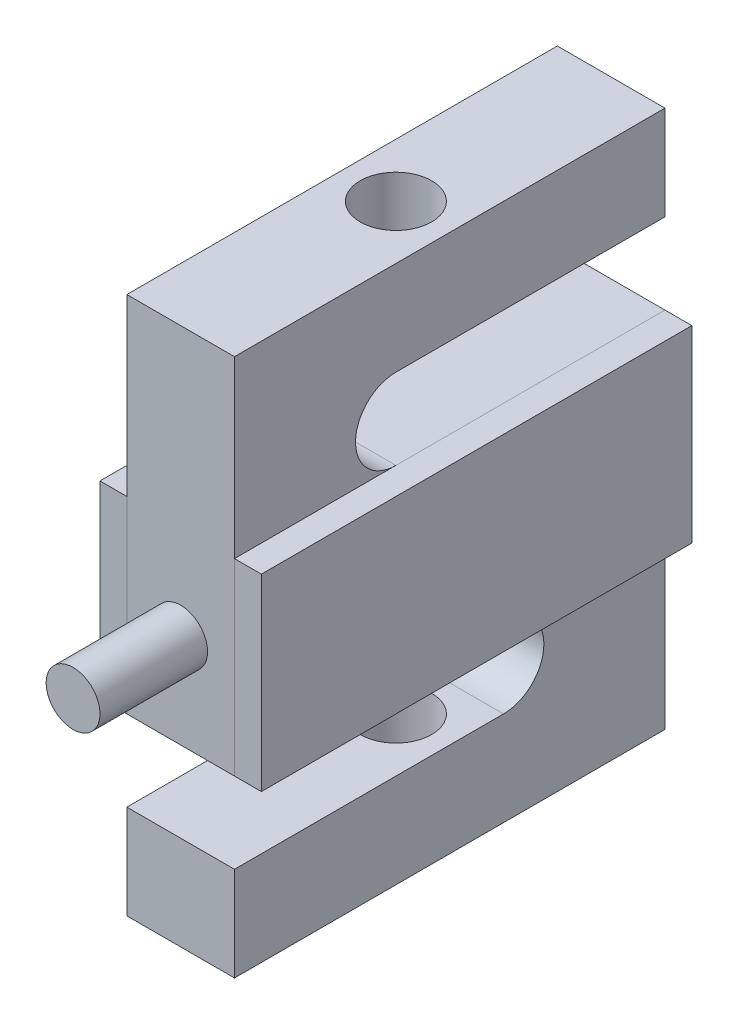
ISO-10303-21;
HEADER;
FILE_DESCRIPTION(('STEP AP214'),'2;1');
FILE_NAME('part.step','',(''),(''),'','','');
FILE_SCHEMA(('AUTOMOTIVE_DESIGN { 1 0 10303 214 1 1 1 1 }'));
ENDSEC;
DATA;
#1=APPLICATION_CONTEXT('core data for automotive mechanical design processes');
#2=APPLICATION_PROTOCOL_DEFINITION('international standard','automotive_design',2000,#1);
#3=PRODUCT_CONTEXT('',#1,'mechanical');
#4=PRODUCT('Part','Part','',(#3));
#5=PRODUCT_RELATED_PRODUCT_CATEGORY('part','',(#4));
#6=PRODUCT_DEFINITION_FORMATION('','',#4);
#7=PRODUCT_DEFINITION_CONTEXT('part definition',#1,'design');
#8=PRODUCT_DEFINITION('design','',#6,#7);
#9=PRODUCT_DEFINITION_SHAPE('','',#8);
#10=(LENGTH_UNIT() NAMED_UNIT(*) SI_UNIT(.MILLI.,.METRE.));
#11=(NAMED_UNIT(*) PLANE_ANGLE_UNIT() SI_UNIT($,.RADIAN.));
#12=(NAMED_UNIT(*) SI_UNIT($,.STERADIAN.) SOLID_ANGLE_UNIT());
#13=UNCERTAINTY_MEASURE_WITH_UNIT(LENGTH_MEASURE(1.E-05),#10,'distance_accuracy_value','');
#14=(GEOMETRIC_REPRESENTATION_CONTEXT(3) GLOBAL_UNCERTAINTY_ASSIGNED_CONTEXT((#13)) GLOBAL_UNIT_ASSIGNED_CONTEXT((#10,
#11,#12)) REPRESENTATION_CONTEXT('',''));
#15=CARTESIAN_POINT('',(0.,0.,0.));
#16=DIRECTION('',(0.,0.,1.));
#17=DIRECTION('',(1.,0.,0.));
#18=AXIS2_PLACEMENT_3D('',#15,#16,#17);
#19=CARTESIAN_POINT('',(-9.525,20.6375,-50.8));
#20=DIRECTION('',(0.,1.,0.));
#21=DIRECTION('',(0.,0.,1.));
#22=AXIS2_PLACEMENT_3D('',#19,#20,#21);
#23=PLANE('',#22);
#24=DIRECTION('',(0.,0.,1.));
#25=VECTOR('',#24,1.);
#26=CARTESIAN_POINT('',(-6.35,20.6375,-50.8));
#27=LINE('',#26,#25);
#28=CARTESIAN_POINT('',(-6.35,20.6375,-50.8));
#29=VERTEX_POINT('',#28);
#30=CARTESIAN_POINT('',(-6.35,20.6375,0.));
#31=VERTEX_POINT('',#30);
#32=EDGE_CURVE('E88',#29,#31,#27,.T.);
#33=ORIENTED_EDGE('',*,*,#32,.T.);
#34=DIRECTION('',(1.,0.,0.));
#35=VECTOR('',#34,1.);
#36=CARTESIAN_POINT('',(-9.525,20.6375,0.));
#37=LINE('',#36,#35);
#38=CARTESIAN_POINT('',(-9.525,20.6375,0.));
#39=VERTEX_POINT('',#38);
#40=EDGE_CURVE('E12',#39,#31,#37,.T.);
#41=ORIENTED_EDGE('',*,*,#40,.F.);
#42=DIRECTION('',(0.,0.,1.));
#43=VECTOR('',#42,1.);
#44=CARTESIAN_POINT('',(-9.525,20.6375,-50.8));
#45=LINE('',#44,#43);
#46=CARTESIAN_POINT('',(-9.525,20.6375,-50.8));
#47=VERTEX_POINT('',#46);
#48=EDGE_CURVE('E106',#47,#39,#45,.T.);
#49=ORIENTED_EDGE('',*,*,#48,.F.);
#50=DIRECTION('',(1.,0.,0.));
#51=VECTOR('',#50,1.);
#52=CARTESIAN_POINT('',(-9.525,20.6375,-50.8));
#53=LINE('',#52,#51);
#54=EDGE_CURVE('E100',#47,#29,#53,.T.);
#55=ORIENTED_EDGE('',*,*,#54,.T.);
#56=EDGE_LOOP('',(#33,#41,#49,#55));
#57=FACE_BOUND('',#56,.T.);
#58=ADVANCED_FACE('F44',(#57),#23,.F.);
#59=CARTESIAN_POINT('',(-9.525,20.6375,0.));
#60=DIRECTION('',(0.,0.,-1.));
#61=DIRECTION('',(-1.,0.,0.));
#62=AXIS2_PLACEMENT_3D('',#59,#60,#61);
#63=PLANE('',#62);
#64=DIRECTION('',(0.,1.,0.));
#65=VECTOR('',#64,1.);
#66=CARTESIAN_POINT('',(-6.35,20.6375,0.));
#67=LINE('',#66,#65);
#68=CARTESIAN_POINT('',(-6.35,42.8625,0.));
#69=VERTEX_POINT('',#68);
#70=EDGE_CURVE('E84',#31,#69,#67,.T.);
#71=ORIENTED_EDGE('',*,*,#70,.T.);
#72=DIRECTION('',(1.,0.,0.));
#73=VECTOR('',#72,1.);
#74=CARTESIAN_POINT('',(-9.525,42.8625,0.));
#75=LINE('',#74,#73);
#76=CARTESIAN_POINT('',(-9.525,42.8625,0.));
#77=VERTEX_POINT('',#76);
#78=EDGE_CURVE('E51',#77,#69,#75,.T.);
#79=ORIENTED_EDGE('',*,*,#78,.F.);
#80=DIRECTION('',(0.,1.,0.));
#81=VECTOR('',#80,1.);
#82=CARTESIAN_POINT('',(-9.525,20.6375,0.));
#83=LINE('',#82,#81);
#84=EDGE_CURVE('E96',#39,#77,#83,.T.);
#85=ORIENTED_EDGE('',*,*,#84,.F.);
#86=ORIENTED_EDGE('',*,*,#40,.T.);
#87=EDGE_LOOP('',(#71,#79,#85,#86));
#88=FACE_BOUND('',#87,.T.);
#89=ADVANCED_FACE('F95',(#88),#63,.F.);
#90=CARTESIAN_POINT('',(-9.525,42.8625,0.));
#91=DIRECTION('',(0.,-1.,0.));
#92=DIRECTION('',(0.,0.,-1.));
#93=AXIS2_PLACEMENT_3D('',#90,#91,#92);
#94=PLANE('',#93);
#95=DIRECTION('',(0.,0.,-1.));
#96=VECTOR('',#95,1.);
#97=CARTESIAN_POINT('',(-6.35,42.8625,0.));
#98=LINE('',#97,#96);
#99=CARTESIAN_POINT('',(-6.35,42.8625,-50.8));
#100=VERTEX_POINT('',#99);
#101=EDGE_CURVE('E89',#69,#100,#98,.T.);
#102=ORIENTED_EDGE('',*,*,#101,.T.);
#103=DIRECTION('',(1.,0.,0.));
#104=VECTOR('',#103,1.);
#105=CARTESIAN_POINT('',(-9.525,42.8625,-50.8));
#106=LINE('',#105,#104);
#107=CARTESIAN_POINT('',(-9.525,42.8625,-50.8));
#108=VERTEX_POINT('',#107);
#109=EDGE_CURVE('E112',#108,#100,#106,.T.);
#110=ORIENTED_EDGE('',*,*,#109,.F.);
#111=DIRECTION('',(0.,0.,-1.));
#112=VECTOR('',#111,1.);
#113=CARTESIAN_POINT('',(-9.525,42.8625,0.));
#114=LINE('',#113,#112);
#115=EDGE_CURVE('E63',#77,#108,#114,.T.);
#116=ORIENTED_EDGE('',*,*,#115,.F.);
#117=ORIENTED_EDGE('',*,*,#78,.T.);
#118=EDGE_LOOP('',(#102,#110,#116,#117));
#119=FACE_BOUND('',#118,.T.);
#120=ADVANCED_FACE('F115',(#119),#94,.F.);
#121=CARTESIAN_POINT('',(-9.525,42.8625,-50.8));
#122=DIRECTION('',(0.,0.,1.));
#123=DIRECTION('',(1.,0.,0.));
#124=AXIS2_PLACEMENT_3D('',#121,#122,#123);
#125=PLANE('',#124);
#126=DIRECTION('',(0.,-1.,0.));
#127=VECTOR('',#126,1.);
#128=CARTESIAN_POINT('',(-6.35,42.8625,-50.8));
#129=LINE('',#128,#127);
#130=EDGE_CURVE('E104',#100,#29,#129,.T.);
#131=ORIENTED_EDGE('',*,*,#130,.T.);
#132=ORIENTED_EDGE('',*,*,#54,.F.);
#133=DIRECTION('',(0.,-1.,0.));
#134=VECTOR('',#133,1.);
#135=CARTESIAN_POINT('',(-9.525,42.8625,-50.8));
#136=LINE('',#135,#134);
#137=EDGE_CURVE('E58',#108,#47,#136,.T.);
#138=ORIENTED_EDGE('',*,*,#137,.F.);
#139=ORIENTED_EDGE('',*,*,#109,.T.);
#140=EDGE_LOOP('',(#131,#132,#138,#139));
#141=FACE_BOUND('',#140,.T.);
#142=ADVANCED_FACE('F117',(#141),#125,.F.);
#143=CARTESIAN_POINT('',(-9.525,20.6375,0.));
#144=DIRECTION('',(-1.,0.,0.));
#145=DIRECTION('',(0.,0.,1.));
#146=AXIS2_PLACEMENT_3D('',#143,#144,#145);
#147=PLANE('',#146);
#148=ORIENTED_EDGE('',*,*,#48,.T.);
#149=ORIENTED_EDGE('',*,*,#84,.T.);
#150=ORIENTED_EDGE('',*,*,#115,.T.);
#151=ORIENTED_EDGE('',*,*,#137,.T.);
#152=EDGE_LOOP('',(#148,#149,#150,#151));
#153=FACE_BOUND('',#152,.T.);
#154=ADVANCED_FACE('F118',(#153),#147,.T.);
#155=CARTESIAN_POINT('',(-6.35,20.6375,0.));
#156=DIRECTION('',(-1.,0.,0.));
#157=DIRECTION('',(0.,0.,1.));
#158=AXIS2_PLACEMENT_3D('',#155,#156,#157);
#159=PLANE('',#158);
#160=ORIENTED_EDGE('',*,*,#32,.F.);
#161=ORIENTED_EDGE('',*,*,#130,.F.);
#162=ORIENTED_EDGE('',*,*,#101,.F.);
#163=ORIENTED_EDGE('',*,*,#70,.F.);
#164=EDGE_LOOP('',(#160,#161,#162,#163));
#165=FACE_BOUND('',#164,.T.);
#166=ADVANCED_FACE('F85',(#165),#159,.F.);
#167=CLOSED_SHELL('',(#58,#89,#120,#142,#154,#166));
#168=MANIFOLD_SOLID_BREP('B2',#167);
#169=CARTESIAN_POINT('',(9.525,42.8625,-50.8));
#170=DIRECTION('',(0.,0.,1.));
#171=DIRECTION('',(1.,0.,0.));
#172=AXIS2_PLACEMENT_3D('',#169,#170,#171);
#173=PLANE('',#172);
#174=DIRECTION('',(0.,1.,0.));
#175=VECTOR('',#174,1.);
#176=CARTESIAN_POINT('',(6.35,42.8625,-50.8));
#177=LINE('',#176,#175);
#178=CARTESIAN_POINT('',(6.35,20.6375,-50.8));
#179=VERTEX_POINT('',#178);
#180=CARTESIAN_POINT('',(6.35,42.8625,-50.8));
#181=VERTEX_POINT('',#180);
#182=EDGE_CURVE('E221',#179,#181,#177,.T.);
#183=ORIENTED_EDGE('',*,*,#182,.T.);
#184=DIRECTION('',(-1.,0.,0.));
#185=VECTOR('',#184,1.);
#186=CARTESIAN_POINT('',(9.525,42.8625,-50.8));
#187=LINE('',#186,#185);
#188=CARTESIAN_POINT('',(9.525,42.8625,-50.8));
#189=VERTEX_POINT('',#188);
#190=EDGE_CURVE('E42',#189,#181,#187,.T.);
#191=ORIENTED_EDGE('',*,*,#190,.F.);
#192=DIRECTION('',(0.,1.,0.));
#193=VECTOR('',#192,1.);
#194=CARTESIAN_POINT('',(9.525,42.8625,-50.8));
#195=LINE('',#194,#193);
#196=CARTESIAN_POINT('',(9.525,20.6375,-50.8));
#197=VERTEX_POINT('',#196);
#198=EDGE_CURVE('E239',#197,#189,#195,.T.);
#199=ORIENTED_EDGE('',*,*,#198,.F.);
#200=DIRECTION('',(-1.,0.,0.));
#201=VECTOR('',#200,1.);
#202=CARTESIAN_POINT('',(9.525,20.6375,-50.8));
#203=LINE('',#202,#201);
#204=EDGE_CURVE('E233',#197,#179,#203,.T.);
#205=ORIENTED_EDGE('',*,*,#204,.T.);
#206=EDGE_LOOP('',(#183,#191,#199,#205));
#207=FACE_BOUND('',#206,.T.);
#208=ADVANCED_FACE('F177',(#207),#173,.F.);
#209=CARTESIAN_POINT('',(9.525,42.8625,-50.8));
#210=DIRECTION('',(0.,-1.,0.));
#211=DIRECTION('',(0.,0.,-1.));
#212=AXIS2_PLACEMENT_3D('',#209,#210,#211);
#213=PLANE('',#212);
#214=DIRECTION('',(0.,0.,1.));
#215=VECTOR('',#214,1.);
#216=CARTESIAN_POINT('',(6.35,42.8625,-50.8));
#217=LINE('',#216,#215);
#218=CARTESIAN_POINT('',(6.35,42.8625,0.));
#219=VERTEX_POINT('',#218);
#220=EDGE_CURVE('E217',#181,#219,#217,.T.);
#221=ORIENTED_EDGE('',*,*,#220,.T.);
#222=DIRECTION('',(-1.,0.,0.));
#223=VECTOR('',#222,1.);
#224=CARTESIAN_POINT('',(9.525,42.8625,0.));
#225=LINE('',#224,#223);
#226=CARTESIAN_POINT('',(9.525,42.8625,0.));
#227=VERTEX_POINT('',#226);
#228=EDGE_CURVE('E184',#227,#219,#225,.T.);
#229=ORIENTED_EDGE('',*,*,#228,.F.);
#230=DIRECTION('',(0.,0.,1.));
#231=VECTOR('',#230,1.);
#232=CARTESIAN_POINT('',(9.525,42.8625,-50.8));
#233=LINE('',#232,#231);
#234=EDGE_CURVE('E229',#189,#227,#233,.T.);
#235=ORIENTED_EDGE('',*,*,#234,.F.);
#236=ORIENTED_EDGE('',*,*,#190,.T.);
#237=EDGE_LOOP('',(#221,#229,#235,#236));
#238=FACE_BOUND('',#237,.T.);
#239=ADVANCED_FACE('F228',(#238),#213,.F.);
#240=CARTESIAN_POINT('',(9.525,42.8625,0.));
#241=DIRECTION('',(0.,0.,-1.));
#242=DIRECTION('',(-1.,0.,0.));
#243=AXIS2_PLACEMENT_3D('',#240,#241,#242);
#244=PLANE('',#243);
#245=DIRECTION('',(0.,-1.,0.));
#246=VECTOR('',#245,1.);
#247=CARTESIAN_POINT('',(6.35,42.8625,0.));
#248=LINE('',#247,#246);
#249=CARTESIAN_POINT('',(6.35,20.6375,0.));
#250=VERTEX_POINT('',#249);
#251=EDGE_CURVE('E222',#219,#250,#248,.T.);
#252=ORIENTED_EDGE('',*,*,#251,.T.);
#253=DIRECTION('',(-1.,0.,0.));
#254=VECTOR('',#253,1.);
#255=CARTESIAN_POINT('',(9.525,20.6375,0.));
#256=LINE('',#255,#254);
#257=CARTESIAN_POINT('',(9.525,20.6375,0.));
#258=VERTEX_POINT('',#257);
#259=EDGE_CURVE('E245',#258,#250,#256,.T.);
#260=ORIENTED_EDGE('',*,*,#259,.F.);
#261=DIRECTION('',(0.,-1.,0.));
#262=VECTOR('',#261,1.);
#263=CARTESIAN_POINT('',(9.525,42.8625,0.));
#264=LINE('',#263,#262);
#265=EDGE_CURVE('E196',#227,#258,#264,.T.);
#266=ORIENTED_EDGE('',*,*,#265,.F.);
#267=ORIENTED_EDGE('',*,*,#228,.T.);
#268=EDGE_LOOP('',(#252,#260,#266,#267));
#269=FACE_BOUND('',#268,.T.);
#270=ADVANCED_FACE('F248',(#269),#244,.F.);
#271=CARTESIAN_POINT('',(9.525,20.6375,-50.8));
#272=DIRECTION('',(0.,1.,0.));
#273=DIRECTION('',(0.,0.,1.));
#274=AXIS2_PLACEMENT_3D('',#271,#272,#273);
#275=PLANE('',#274);
#276=DIRECTION('',(0.,0.,-1.));
#277=VECTOR('',#276,1.);
#278=CARTESIAN_POINT('',(6.35,20.6375,-50.8));
#279=LINE('',#278,#277);
#280=EDGE_CURVE('E237',#250,#179,#279,.T.);
#281=ORIENTED_EDGE('',*,*,#280,.T.);
#282=ORIENTED_EDGE('',*,*,#204,.F.);
#283=DIRECTION('',(0.,0.,-1.));
#284=VECTOR('',#283,1.);
#285=CARTESIAN_POINT('',(9.525,20.6375,-50.8));
#286=LINE('',#285,#284);
#287=EDGE_CURVE('E191',#258,#197,#286,.T.);
#288=ORIENTED_EDGE('',*,*,#287,.F.);
#289=ORIENTED_EDGE('',*,*,#259,.T.);
#290=EDGE_LOOP('',(#281,#282,#288,#289));
#291=FACE_BOUND('',#290,.T.);
#292=ADVANCED_FACE('F250',(#291),#275,.F.);
#293=CARTESIAN_POINT('',(9.525,20.6375,-50.8));
#294=DIRECTION('',(-1.,0.,0.));
#295=DIRECTION('',(0.,0.,1.));
#296=AXIS2_PLACEMENT_3D('',#293,#294,#295);
#297=PLANE('',#296);
#298=ORIENTED_EDGE('',*,*,#198,.T.);
#299=ORIENTED_EDGE('',*,*,#234,.T.);
#300=ORIENTED_EDGE('',*,*,#265,.T.);
#301=ORIENTED_EDGE('',*,*,#287,.T.);
#302=EDGE_LOOP('',(#298,#299,#300,#301));
#303=FACE_BOUND('',#302,.T.);
#304=ADVANCED_FACE('F251',(#303),#297,.F.);
#305=CARTESIAN_POINT('',(6.35,20.6375,-50.8));
#306=DIRECTION('',(-1.,0.,0.));
#307=DIRECTION('',(0.,0.,1.));
#308=AXIS2_PLACEMENT_3D('',#305,#306,#307);
#309=PLANE('',#308);
#310=ORIENTED_EDGE('',*,*,#182,.F.);
#311=ORIENTED_EDGE('',*,*,#280,.F.);
#312=ORIENTED_EDGE('',*,*,#251,.F.);
#313=ORIENTED_EDGE('',*,*,#220,.F.);
#314=EDGE_LOOP('',(#310,#311,#312,#313));
#315=FACE_BOUND('',#314,.T.);
#316=ADVANCED_FACE('F218',(#315),#309,.T.);
#317=CLOSED_SHELL('',(#208,#239,#270,#292,#304,#316));
#318=MANIFOLD_SOLID_BREP('B6',#317);
#319=CARTESIAN_POINT('',(6.35,20.6375,0.));
#320=DIRECTION('',(0.,0.,-1.));
#321=DIRECTION('',(-1.,0.,0.));
#322=AXIS2_PLACEMENT_3D('',#319,#320,#321);
#323=PLANE('',#322);
#324=DIRECTION('',(0.,-1.,0.));
#325=VECTOR('',#324,1.);
#326=CARTESIAN_POINT('',(-6.35,20.6375,0.));
#327=LINE('',#326,#325);
#328=CARTESIAN_POINT('',(-6.35,63.5,0.));
#329=VERTEX_POINT('',#328);
#330=CARTESIAN_POINT('',(-6.35,20.6375,0.));
#331=VERTEX_POINT('',#330);
#332=EDGE_CURVE('E428',#329,#331,#327,.T.);
#333=ORIENTED_EDGE('',*,*,#332,.T.);
#334=DIRECTION('',(-1.,0.,0.));
#335=VECTOR('',#334,1.);
#336=CARTESIAN_POINT('',(6.35,20.6375,0.));
#337=LINE('',#336,#335);
#338=CARTESIAN_POINT('',(6.35,20.6375,0.));
#339=VERTEX_POINT('',#338);
#340=EDGE_CURVE('E464',#339,#331,#337,.T.);
#341=ORIENTED_EDGE('',*,*,#340,.F.);
#342=DIRECTION('',(0.,-1.,0.));
#343=VECTOR('',#342,1.);
#344=CARTESIAN_POINT('',(6.35,20.6375,0.));
#345=LINE('',#344,#343);
#346=CARTESIAN_POINT('',(6.35,63.5,0.));
#347=VERTEX_POINT('',#346);
#348=EDGE_CURVE('E451',#347,#339,#345,.T.);
#349=ORIENTED_EDGE('',*,*,#348,.F.);
#350=DIRECTION('',(-1.,0.,0.));
#351=VECTOR('',#350,1.);
#352=CARTESIAN_POINT('',(6.35,63.5,0.));
#353=LINE('',#352,#351);
#354=EDGE_CURVE('E467',#347,#329,#353,.T.);
#355=ORIENTED_EDGE('',*,*,#354,.T.);
#356=EDGE_LOOP('',(#333,#341,#349,#355));
#357=FACE_BOUND('',#356,.T.);
#358=CARTESIAN_POINT('',(0.,31.75,0.));
#359=DIRECTION('',(0.,0.,-1.));
#360=DIRECTION('',(-1.,0.,0.));
#361=AXIS2_PLACEMENT_3D('',#358,#359,#360);
#362=CIRCLE('',#361,3.175);
#363=CARTESIAN_POINT('',(-3.175,31.75,0.));
#364=VERTEX_POINT('',#363);
#365=EDGE_CURVE('E175',#364,#364,#362,.F.);
#366=ORIENTED_EDGE('',*,*,#365,.F.);
#367=EDGE_LOOP('',(#366));
#368=FACE_BOUND('',#367,.T.);
#369=ADVANCED_FACE('F301',(#357,#368),#323,.F.);
#370=CARTESIAN_POINT('',(6.35,63.5,0.));
#371=DIRECTION('',(0.,-1.,0.));
#372=DIRECTION('',(0.,0.,-1.));
#373=AXIS2_PLACEMENT_3D('',#370,#371,#372);
#374=PLANE('',#373);
#375=DIRECTION('',(0.,0.,1.));
#376=VECTOR('',#375,1.);
#377=CARTESIAN_POINT('',(-6.35,63.5,0.));
#378=LINE('',#377,#376);
#379=CARTESIAN_POINT('',(-6.35,63.5,-50.8));
#380=VERTEX_POINT('',#379);
#381=EDGE_CURVE('E426',#380,#329,#378,.T.);
#382=ORIENTED_EDGE('',*,*,#381,.T.);
#383=ORIENTED_EDGE('',*,*,#354,.F.);
#384=DIRECTION('',(0.,0.,1.));
#385=VECTOR('',#384,1.);
#386=CARTESIAN_POINT('',(6.35,63.5,0.));
#387=LINE('',#386,#385);
#388=CARTESIAN_POINT('',(6.35,63.5,-50.8));
#389=VERTEX_POINT('',#388);
#390=EDGE_CURVE('E449',#389,#347,#387,.T.);
#391=ORIENTED_EDGE('',*,*,#390,.F.);
#392=DIRECTION('',(-1.,0.,0.));
#393=VECTOR('',#392,1.);
#394=CARTESIAN_POINT('',(6.35,63.5,-50.8));
#395=LINE('',#394,#393);
#396=EDGE_CURVE('E470',#389,#380,#395,.T.);
#397=ORIENTED_EDGE('',*,*,#396,.T.);
#398=EDGE_LOOP('',(#382,#383,#391,#397));
#399=FACE_BOUND('',#398,.T.);
#400=CARTESIAN_POINT('',(0.,63.5,-25.4));
#401=DIRECTION('',(0.,1.,0.));
#402=DIRECTION('',(0.,0.,1.));
#403=AXIS2_PLACEMENT_3D('',#400,#401,#402);
#404=CIRCLE('',#403,4.21639999999999);
#405=CARTESIAN_POINT('',(0.,63.5,-21.1836));
#406=VERTEX_POINT('',#405);
#407=EDGE_CURVE('E413',#406,#406,#404,.T.);
#408=ORIENTED_EDGE('',*,*,#407,.F.);
#409=EDGE_LOOP('',(#408));
#410=FACE_BOUND('',#409,.T.);
#411=ADVANCED_FACE('F513',(#399,#410),#374,.F.);
#412=CARTESIAN_POINT('',(6.35,0.,0.));
#413=DIRECTION('',(0.,0.,-1.));
#414=DIRECTION('',(-1.,0.,0.));
#415=AXIS2_PLACEMENT_3D('',#412,#413,#414);
#416=PLANE('',#415);
#417=DIRECTION('',(0.,-1.,0.));
#418=VECTOR('',#417,1.);
#419=CARTESIAN_POINT('',(-6.35,0.,0.));
#420=LINE('',#419,#418);
#421=CARTESIAN_POINT('',(-6.35,11.1125,0.));
#422=VERTEX_POINT('',#421);
#423=CARTESIAN_POINT('',(-6.35,0.,0.));
#424=VERTEX_POINT('',#423);
#425=EDGE_CURVE('E395',#422,#424,#420,.T.);
#426=ORIENTED_EDGE('',*,*,#425,.T.);
#427=DIRECTION('',(-1.,0.,0.));
#428=VECTOR('',#427,1.);
#429=CARTESIAN_POINT('',(6.35,0.,0.));
#430=LINE('',#429,#428);
#431=CARTESIAN_POINT('',(6.35,0.,0.));
#432=VERTEX_POINT('',#431);
#433=EDGE_CURVE('E309',#432,#424,#430,.T.);
#434=ORIENTED_EDGE('',*,*,#433,.F.);
#435=DIRECTION('',(0.,-1.,0.));
#436=VECTOR('',#435,1.);
#437=CARTESIAN_POINT('',(6.35,0.,0.));
#438=LINE('',#437,#436);
#439=CARTESIAN_POINT('',(6.35,11.1125,0.));
#440=VERTEX_POINT('',#439);
#441=EDGE_CURVE('E436',#440,#432,#438,.T.);
#442=ORIENTED_EDGE('',*,*,#441,.F.);
#443=DIRECTION('',(-1.,0.,0.));
#444=VECTOR('',#443,1.);
#445=CARTESIAN_POINT('',(6.35,11.1125,0.));
#446=LINE('',#445,#444);
#447=EDGE_CURVE('E409',#440,#422,#446,.T.);
#448=ORIENTED_EDGE('',*,*,#447,.T.);
#449=EDGE_LOOP('',(#426,#434,#442,#448));
#450=FACE_BOUND('',#449,.T.);
#451=ADVANCED_FACE('F303',(#450),#416,.F.);
#452=CARTESIAN_POINT('',(6.35,0.,0.));
#453=DIRECTION('',(0.,1.,0.));
#454=DIRECTION('',(0.,0.,1.));
#455=AXIS2_PLACEMENT_3D('',#452,#453,#454);
#456=PLANE('',#455);
#457=CARTESIAN_POINT('',(0.,0.,-25.4));
#458=DIRECTION('',(0.,-1.,0.));
#459=DIRECTION('',(0.,0.,-1.));
#460=AXIS2_PLACEMENT_3D('',#457,#458,#459);
#461=CIRCLE('',#460,4.21639999999999);
#462=CARTESIAN_POINT('',(0.,0.,-29.6164));
#463=VERTEX_POINT('',#462);
#464=EDGE_CURVE('E565',#463,#463,#461,.T.);
#465=ORIENTED_EDGE('',*,*,#464,.F.);
#466=EDGE_LOOP('',(#465));
#467=FACE_BOUND('',#466,.T.);
#468=DIRECTION('',(0.,0.,-1.));
#469=VECTOR('',#468,1.);
#470=CARTESIAN_POINT('',(-6.35,0.,0.));
#471=LINE('',#470,#469);
#472=CARTESIAN_POINT('',(-6.35,0.,-50.8));
#473=VERTEX_POINT('',#472);
#474=EDGE_CURVE('E390',#424,#473,#471,.T.);
#475=ORIENTED_EDGE('',*,*,#474,.T.);
#476=DIRECTION('',(-1.,0.,0.));
#477=VECTOR('',#476,1.);
#478=CARTESIAN_POINT('',(6.35,0.,-50.8));
#479=LINE('',#478,#477);
#480=CARTESIAN_POINT('',(6.35,0.,-50.8));
#481=VERTEX_POINT('',#480);
#482=EDGE_CURVE('E407',#481,#473,#479,.T.);
#483=ORIENTED_EDGE('',*,*,#482,.F.);
#484=DIRECTION('',(0.,0.,-1.));
#485=VECTOR('',#484,1.);
#486=CARTESIAN_POINT('',(6.35,0.,0.));
#487=LINE('',#486,#485);
#488=EDGE_CURVE('E404',#432,#481,#487,.T.);
#489=ORIENTED_EDGE('',*,*,#488,.F.);
#490=ORIENTED_EDGE('',*,*,#433,.T.);
#491=EDGE_LOOP('',(#475,#483,#489,#490));
#492=FACE_BOUND('',#491,.T.);
#493=ADVANCED_FACE('F403',(#467,#492),#456,.F.);
#494=CARTESIAN_POINT('',(6.35,0.,-50.8));
#495=DIRECTION('',(0.,0.,1.));
#496=DIRECTION('',(1.,0.,0.));
#497=AXIS2_PLACEMENT_3D('',#494,#495,#496);
#498=PLANE('',#497);
#499=DIRECTION('',(0.,1.,0.));
#500=VECTOR('',#499,1.);
#501=CARTESIAN_POINT('',(-6.35,0.,-50.8));
#502=LINE('',#501,#500);
#503=CARTESIAN_POINT('',(-6.35,42.8625,-50.8));
#504=VERTEX_POINT('',#503);
#505=EDGE_CURVE('E397',#473,#504,#502,.T.);
#506=ORIENTED_EDGE('',*,*,#505,.T.);
#507=DIRECTION('',(-1.,0.,0.));
#508=VECTOR('',#507,1.);
#509=CARTESIAN_POINT('',(6.35,42.8625,-50.8));
#510=LINE('',#509,#508);
#511=CARTESIAN_POINT('',(6.35,42.8625,-50.8));
#512=VERTEX_POINT('',#511);
#513=EDGE_CURVE('E482',#512,#504,#510,.T.);
#514=ORIENTED_EDGE('',*,*,#513,.F.);
#515=DIRECTION('',(0.,1.,0.));
#516=VECTOR('',#515,1.);
#517=CARTESIAN_POINT('',(6.35,0.,-50.8));
#518=LINE('',#517,#516);
#519=EDGE_CURVE('E439',#481,#512,#518,.T.);
#520=ORIENTED_EDGE('',*,*,#519,.F.);
#521=ORIENTED_EDGE('',*,*,#482,.T.);
#522=EDGE_LOOP('',(#506,#514,#520,#521));
#523=FACE_BOUND('',#522,.T.);
#524=ADVANCED_FACE('F487',(#523),#498,.F.);
#525=CARTESIAN_POINT('',(6.35,42.8625,-19.05));
#526=DIRECTION('',(0.,-1.,0.));
#527=DIRECTION('',(0.,0.,-1.));
#528=AXIS2_PLACEMENT_3D('',#525,#526,#527);
#529=PLANE('',#528);
#530=DIRECTION('',(0.,0.,1.));
#531=VECTOR('',#530,1.);
#532=CARTESIAN_POINT('',(-6.35,42.8625,-19.05));
#533=LINE('',#532,#531);
#534=CARTESIAN_POINT('',(-6.35,42.8625,-19.05));
#535=VERTEX_POINT('',#534);
#536=EDGE_CURVE('E418',#504,#535,#533,.T.);
#537=ORIENTED_EDGE('',*,*,#536,.T.);
#538=DIRECTION('',(-1.,0.,0.));
#539=VECTOR('',#538,1.);
#540=CARTESIAN_POINT('',(6.35,42.8625,-19.05));
#541=LINE('',#540,#539);
#542=CARTESIAN_POINT('',(6.35,42.8625,-19.05));
#543=VERTEX_POINT('',#542);
#544=EDGE_CURVE('E479',#543,#535,#541,.T.);
#545=ORIENTED_EDGE('',*,*,#544,.F.);
#546=DIRECTION('',(0.,0.,1.));
#547=VECTOR('',#546,1.);
#548=CARTESIAN_POINT('',(6.35,42.8625,-19.05));
#549=LINE('',#548,#547);
#550=EDGE_CURVE('E441',#512,#543,#549,.T.);
#551=ORIENTED_EDGE('',*,*,#550,.F.);
#552=ORIENTED_EDGE('',*,*,#513,.T.);
#553=EDGE_LOOP('',(#537,#545,#551,#552));
#554=FACE_BOUND('',#553,.T.);
#555=ADVANCED_FACE('F495',(#554),#529,.F.);
#556=CARTESIAN_POINT('',(6.35,47.625,-19.05));
#557=DIRECTION('',(-1.,0.,0.));
#558=DIRECTION('',(0.,0.,1.));
#559=AXIS2_PLACEMENT_3D('',#556,#557,#558);
#560=CYLINDRICAL_SURFACE('',#559,4.7625);
#561=CARTESIAN_POINT('',(-6.35,47.625,-19.05));
#562=DIRECTION('',(-1.,0.,0.));
#563=DIRECTION('',(0.,0.,-1.));
#564=AXIS2_PLACEMENT_3D('',#561,#562,#563);
#565=CIRCLE('',#564,4.7625);
#566=CARTESIAN_POINT('',(-6.35,52.3875,-19.05));
#567=VERTEX_POINT('',#566);
#568=EDGE_CURVE('E420',#535,#567,#565,.T.);
#569=ORIENTED_EDGE('',*,*,#568,.T.);
#570=DIRECTION('',(-1.,0.,0.));
#571=VECTOR('',#570,1.);
#572=CARTESIAN_POINT('',(6.35,52.3875,-19.05));
#573=LINE('',#572,#571);
#574=CARTESIAN_POINT('',(6.35,52.3875,-19.05));
#575=VERTEX_POINT('',#574);
#576=EDGE_CURVE('E476',#575,#567,#573,.T.);
#577=ORIENTED_EDGE('',*,*,#576,.F.);
#578=CARTESIAN_POINT('',(6.35,47.625,-19.05));
#579=DIRECTION('',(-1.,0.,0.));
#580=DIRECTION('',(0.,0.,-1.));
#581=AXIS2_PLACEMENT_3D('',#578,#579,#580);
#582=CIRCLE('',#581,4.7625);
#583=EDGE_CURVE('E443',#543,#575,#582,.T.);
#584=ORIENTED_EDGE('',*,*,#583,.F.);
#585=ORIENTED_EDGE('',*,*,#544,.T.);
#586=EDGE_LOOP('',(#569,#577,#584,#585));
#587=FACE_BOUND('',#586,.T.);
#588=ADVANCED_FACE('F498',(#587),#560,.F.);
#589=CARTESIAN_POINT('',(6.35,52.3875,-50.8));
#590=DIRECTION('',(0.,1.,0.));
#591=DIRECTION('',(0.,0.,1.));
#592=AXIS2_PLACEMENT_3D('',#589,#590,#591);
#593=PLANE('',#592);
#594=CARTESIAN_POINT('',(0.,52.3875,-25.4));
#595=DIRECTION('',(0.,1.,0.));
#596=DIRECTION('',(0.,0.,1.));
#597=AXIS2_PLACEMENT_3D('',#594,#595,#596);
#598=CIRCLE('',#597,4.21639999999999);
#599=CARTESIAN_POINT('',(0.,52.3875,-21.1836));
#600=VERTEX_POINT('',#599);
#601=EDGE_CURVE('E410',#600,#600,#598,.T.);
#602=ORIENTED_EDGE('',*,*,#601,.T.);
#603=EDGE_LOOP('',(#602));
#604=FACE_BOUND('',#603,.T.);
#605=DIRECTION('',(0.,0.,-1.));
#606=VECTOR('',#605,1.);
#607=CARTESIAN_POINT('',(-6.35,52.3875,-50.8));
#608=LINE('',#607,#606);
#609=CARTESIAN_POINT('',(-6.35,52.3875,-50.8));
#610=VERTEX_POINT('',#609);
#611=EDGE_CURVE('E422',#567,#610,#608,.T.);
#612=ORIENTED_EDGE('',*,*,#611,.T.);
#613=DIRECTION('',(-1.,0.,0.));
#614=VECTOR('',#613,1.);
#615=CARTESIAN_POINT('',(6.35,52.3875,-50.8));
#616=LINE('',#615,#614);
#617=CARTESIAN_POINT('',(6.35,52.3875,-50.8));
#618=VERTEX_POINT('',#617);
#619=EDGE_CURVE('E473',#618,#610,#616,.T.);
#620=ORIENTED_EDGE('',*,*,#619,.F.);
#621=DIRECTION('',(0.,0.,-1.));
#622=VECTOR('',#621,1.);
#623=CARTESIAN_POINT('',(6.35,52.3875,-50.8));
#624=LINE('',#623,#622);
#625=EDGE_CURVE('E445',#575,#618,#624,.T.);
#626=ORIENTED_EDGE('',*,*,#625,.F.);
#627=ORIENTED_EDGE('',*,*,#576,.T.);
#628=EDGE_LOOP('',(#612,#620,#626,#627));
#629=FACE_BOUND('',#628,.T.);
#630=ADVANCED_FACE('F503',(#604,#629),#593,.F.);
#631=CARTESIAN_POINT('',(6.35,52.3875,-50.8));
#632=DIRECTION('',(0.,0.,1.));
#633=DIRECTION('',(1.,0.,0.));
#634=AXIS2_PLACEMENT_3D('',#631,#632,#633);
#635=PLANE('',#634);
#636=DIRECTION('',(0.,1.,0.));
#637=VECTOR('',#636,1.);
#638=CARTESIAN_POINT('',(-6.35,52.3875,-50.8));
#639=LINE('',#638,#637);
#640=EDGE_CURVE('E424',#610,#380,#639,.T.);
#641=ORIENTED_EDGE('',*,*,#640,.T.);
#642=ORIENTED_EDGE('',*,*,#396,.F.);
#643=DIRECTION('',(0.,1.,0.));
#644=VECTOR('',#643,1.);
#645=CARTESIAN_POINT('',(6.35,52.3875,-50.8));
#646=LINE('',#645,#644);
#647=EDGE_CURVE('E447',#618,#389,#646,.T.);
#648=ORIENTED_EDGE('',*,*,#647,.F.);
#649=ORIENTED_EDGE('',*,*,#619,.T.);
#650=EDGE_LOOP('',(#641,#642,#648,#649));
#651=FACE_BOUND('',#650,.T.);
#652=ADVANCED_FACE('F509',(#651),#635,.F.);
#653=CARTESIAN_POINT('',(6.35,20.6375,0.));
#654=DIRECTION('',(0.,1.,0.));
#655=DIRECTION('',(0.,0.,1.));
#656=AXIS2_PLACEMENT_3D('',#653,#654,#655);
#657=PLANE('',#656);
#658=DIRECTION('',(0.,0.,-1.));
#659=VECTOR('',#658,1.);
#660=CARTESIAN_POINT('',(-6.35,20.6375,0.));
#661=LINE('',#660,#659);
#662=CARTESIAN_POINT('',(-6.35,20.6375,-31.75));
#663=VERTEX_POINT('',#662);
#664=EDGE_CURVE('E430',#331,#663,#661,.T.);
#665=ORIENTED_EDGE('',*,*,#664,.T.);
#666=DIRECTION('',(-1.,0.,0.));
#667=VECTOR('',#666,1.);
#668=CARTESIAN_POINT('',(6.35,20.6375,-31.75));
#669=LINE('',#668,#667);
#670=CARTESIAN_POINT('',(6.35,20.6375,-31.75));
#671=VERTEX_POINT('',#670);
#672=EDGE_CURVE('E461',#671,#663,#669,.T.);
#673=ORIENTED_EDGE('',*,*,#672,.F.);
#674=DIRECTION('',(0.,0.,-1.));
#675=VECTOR('',#674,1.);
#676=CARTESIAN_POINT('',(6.35,20.6375,0.));
#677=LINE('',#676,#675);
#678=EDGE_CURVE('E453',#339,#671,#677,.T.);
#679=ORIENTED_EDGE('',*,*,#678,.F.);
#680=ORIENTED_EDGE('',*,*,#340,.T.);
#681=EDGE_LOOP('',(#665,#673,#679,#680));
#682=FACE_BOUND('',#681,.T.);
#683=ADVANCED_FACE('F523',(#682),#657,.F.);
#684=CARTESIAN_POINT('',(6.35,15.875,-31.75));
#685=DIRECTION('',(-1.,0.,0.));
#686=DIRECTION('',(0.,0.,1.));
#687=AXIS2_PLACEMENT_3D('',#684,#685,#686);
#688=CYLINDRICAL_SURFACE('',#687,4.7625);
#689=CARTESIAN_POINT('',(-6.35,15.875,-31.75));
#690=DIRECTION('',(-1.,0.,0.));
#691=DIRECTION('',(0.,0.,1.));
#692=AXIS2_PLACEMENT_3D('',#689,#690,#691);
#693=CIRCLE('',#692,4.7625);
#694=CARTESIAN_POINT('',(-6.35,11.1125,-31.75));
#695=VERTEX_POINT('',#694);
#696=EDGE_CURVE('E432',#663,#695,#693,.T.);
#697=ORIENTED_EDGE('',*,*,#696,.T.);
#698=DIRECTION('',(-1.,0.,0.));
#699=VECTOR('',#698,1.);
#700=CARTESIAN_POINT('',(6.35,11.1125,-31.75));
#701=LINE('',#700,#699);
#702=CARTESIAN_POINT('',(6.35,11.1125,-31.75));
#703=VERTEX_POINT('',#702);
#704=EDGE_CURVE('E458',#703,#695,#701,.T.);
#705=ORIENTED_EDGE('',*,*,#704,.F.);
#706=CARTESIAN_POINT('',(6.35,15.875,-31.75));
#707=DIRECTION('',(-1.,0.,0.));
#708=DIRECTION('',(0.,0.,1.));
#709=AXIS2_PLACEMENT_3D('',#706,#707,#708);
#710=CIRCLE('',#709,4.7625);
#711=EDGE_CURVE('E321',#671,#703,#710,.T.);
#712=ORIENTED_EDGE('',*,*,#711,.F.);
#713=ORIENTED_EDGE('',*,*,#672,.T.);
#714=EDGE_LOOP('',(#697,#705,#712,#713));
#715=FACE_BOUND('',#714,.T.);
#716=ADVANCED_FACE('F527',(#715),#688,.F.);
#717=CARTESIAN_POINT('',(6.35,11.1125,-31.75));
#718=DIRECTION('',(0.,-1.,0.));
#719=DIRECTION('',(0.,0.,-1.));
#720=AXIS2_PLACEMENT_3D('',#717,#718,#719);
#721=PLANE('',#720);
#722=CARTESIAN_POINT('',(0.,11.1125,-25.4));
#723=DIRECTION('',(0.,-1.,0.));
#724=DIRECTION('',(0.,0.,-1.));
#725=AXIS2_PLACEMENT_3D('',#722,#723,#724);
#726=CIRCLE('',#725,4.21639999999999);
#727=CARTESIAN_POINT('',(0.,11.1125,-29.6164));
#728=VERTEX_POINT('',#727);
#729=EDGE_CURVE('E567',#728,#728,#726,.T.);
#730=ORIENTED_EDGE('',*,*,#729,.T.);
#731=EDGE_LOOP('',(#730));
#732=FACE_BOUND('',#731,.T.);
#733=DIRECTION('',(0.,0.,1.));
#734=VECTOR('',#733,1.);
#735=CARTESIAN_POINT('',(-6.35,11.1125,-31.75));
#736=LINE('',#735,#734);
#737=EDGE_CURVE('E434',#695,#422,#736,.T.);
#738=ORIENTED_EDGE('',*,*,#737,.T.);
#739=ORIENTED_EDGE('',*,*,#447,.F.);
#740=DIRECTION('',(0.,0.,1.));
#741=VECTOR('',#740,1.);
#742=CARTESIAN_POINT('',(6.35,11.1125,-31.75));
#743=LINE('',#742,#741);
#744=EDGE_CURVE('E316',#703,#440,#743,.T.);
#745=ORIENTED_EDGE('',*,*,#744,.F.);
#746=ORIENTED_EDGE('',*,*,#704,.T.);
#747=EDGE_LOOP('',(#738,#739,#745,#746));
#748=FACE_BOUND('',#747,.T.);
#749=ADVANCED_FACE('F529',(#732,#748),#721,.F.);
#750=CARTESIAN_POINT('',(6.35,15.875,-31.75));
#751=DIRECTION('',(-1.,0.,0.));
#752=DIRECTION('',(0.,0.,1.));
#753=AXIS2_PLACEMENT_3D('',#750,#751,#752);
#754=PLANE('',#753);
#755=ORIENTED_EDGE('',*,*,#441,.T.);
#756=ORIENTED_EDGE('',*,*,#488,.T.);
#757=ORIENTED_EDGE('',*,*,#519,.T.);
#758=ORIENTED_EDGE('',*,*,#550,.T.);
#759=ORIENTED_EDGE('',*,*,#583,.T.);
#760=ORIENTED_EDGE('',*,*,#625,.T.);
#761=ORIENTED_EDGE('',*,*,#647,.T.);
#762=ORIENTED_EDGE('',*,*,#390,.T.);
#763=ORIENTED_EDGE('',*,*,#348,.T.);
#764=ORIENTED_EDGE('',*,*,#678,.T.);
#765=ORIENTED_EDGE('',*,*,#711,.T.);
#766=ORIENTED_EDGE('',*,*,#744,.T.);
#767=EDGE_LOOP('',(#755,#756,#757,#758,#759,#760,#761,#762,#763,#764,#765,#766));
#768=FACE_BOUND('',#767,.T.);
#769=ADVANCED_FACE('F490',(#768),#754,.F.);
#770=CARTESIAN_POINT('',(-6.35,15.875,-31.75));
#771=DIRECTION('',(-1.,0.,0.));
#772=DIRECTION('',(0.,0.,1.));
#773=AXIS2_PLACEMENT_3D('',#770,#771,#772);
#774=PLANE('',#773);
#775=ORIENTED_EDGE('',*,*,#425,.F.);
#776=ORIENTED_EDGE('',*,*,#737,.F.);
#777=ORIENTED_EDGE('',*,*,#696,.F.);
#778=ORIENTED_EDGE('',*,*,#664,.F.);
#779=ORIENTED_EDGE('',*,*,#332,.F.);
#780=ORIENTED_EDGE('',*,*,#381,.F.);
#781=ORIENTED_EDGE('',*,*,#640,.F.);
#782=ORIENTED_EDGE('',*,*,#611,.F.);
#783=ORIENTED_EDGE('',*,*,#568,.F.);
#784=ORIENTED_EDGE('',*,*,#536,.F.);
#785=ORIENTED_EDGE('',*,*,#505,.F.);
#786=ORIENTED_EDGE('',*,*,#474,.F.);
#787=EDGE_LOOP('',(#775,#776,#777,#778,#779,#780,#781,#782,#783,#784,#785,#786));
#788=FACE_BOUND('',#787,.T.);
#789=ADVANCED_FACE('F392',(#788),#774,.T.);
#790=CARTESIAN_POINT('',(0.,63.5,-25.4));
#791=DIRECTION('',(0.,1.,0.));
#792=DIRECTION('',(0.,0.,1.));
#793=AXIS2_PLACEMENT_3D('',#790,#791,#792);
#794=CYLINDRICAL_SURFACE('',#793,4.21639999999999);
#795=ORIENTED_EDGE('',*,*,#601,.F.);
#796=EDGE_LOOP('',(#795));
#797=FACE_BOUND('',#796,.T.);
#798=ORIENTED_EDGE('',*,*,#407,.T.);
#799=EDGE_LOOP('',(#798));
#800=FACE_BOUND('',#799,.T.);
#801=ADVANCED_FACE('F576',(#797,#800),#794,.F.);
#802=CARTESIAN_POINT('',(0.,0.,-25.4));
#803=DIRECTION('',(0.,-1.,0.));
#804=DIRECTION('',(0.,0.,-1.));
#805=AXIS2_PLACEMENT_3D('',#802,#803,#804);
#806=CYLINDRICAL_SURFACE('',#805,4.21639999999999);
#807=ORIENTED_EDGE('',*,*,#729,.F.);
#808=EDGE_LOOP('',(#807));
#809=FACE_BOUND('',#808,.T.);
#810=ORIENTED_EDGE('',*,*,#464,.T.);
#811=EDGE_LOOP('',(#810));
#812=FACE_BOUND('',#811,.T.);
#813=ADVANCED_FACE('F578',(#809,#812),#806,.F.);
#814=CARTESIAN_POINT('',(0.,31.75,12.7));
#815=DIRECTION('',(0.,0.,-1.));
#816=DIRECTION('',(-1.,0.,0.));
#817=AXIS2_PLACEMENT_3D('',#814,#815,#816);
#818=CYLINDRICAL_SURFACE('',#817,3.175);
#819=CARTESIAN_POINT('',(0.,31.75,12.7));
#820=DIRECTION('',(0.,0.,1.));
#821=DIRECTION('',(1.,0.,0.));
#822=AXIS2_PLACEMENT_3D('',#819,#820,#821);
#823=CIRCLE('',#822,3.175);
#824=CARTESIAN_POINT('',(3.175,31.75,12.7));
#825=VERTEX_POINT('',#824);
#826=EDGE_CURVE('E568',#825,#825,#823,.T.);
#827=ORIENTED_EDGE('',*,*,#826,.F.);
#828=EDGE_LOOP('',(#827));
#829=FACE_BOUND('',#828,.T.);
#830=ORIENTED_EDGE('',*,*,#365,.T.);
#831=EDGE_LOOP('',(#830));
#832=FACE_BOUND('',#831,.T.);
#833=ADVANCED_FACE('F585',(#829,#832),#818,.T.);
#834=CARTESIAN_POINT('',(0.,31.75,12.7));
#835=DIRECTION('',(0.,0.,1.));
#836=DIRECTION('',(1.,0.,0.));
#837=AXIS2_PLACEMENT_3D('',#834,#835,#836);
#838=PLANE('',#837);
#839=ORIENTED_EDGE('',*,*,#826,.T.);
#840=EDGE_LOOP('',(#839));
#841=FACE_BOUND('',#840,.T.);
#842=ADVANCED_FACE('F593',(#841),#838,.T.);
#843=CLOSED_SHELL('',(#369,#411,#451,#493,#524,#555,#588,#630,#652,#683,#716,#749,#769,#789,
#801,#813,#833,#842));
#844=MANIFOLD_SOLID_BREP('B36',#843);
#845=ADVANCED_BREP_SHAPE_REPRESENTATION('',(#18,#168,#318,#844),#14);
#846=SHAPE_DEFINITION_REPRESENTATION(#9,#845);
ENDSEC;
END-ISO-10303-21;
